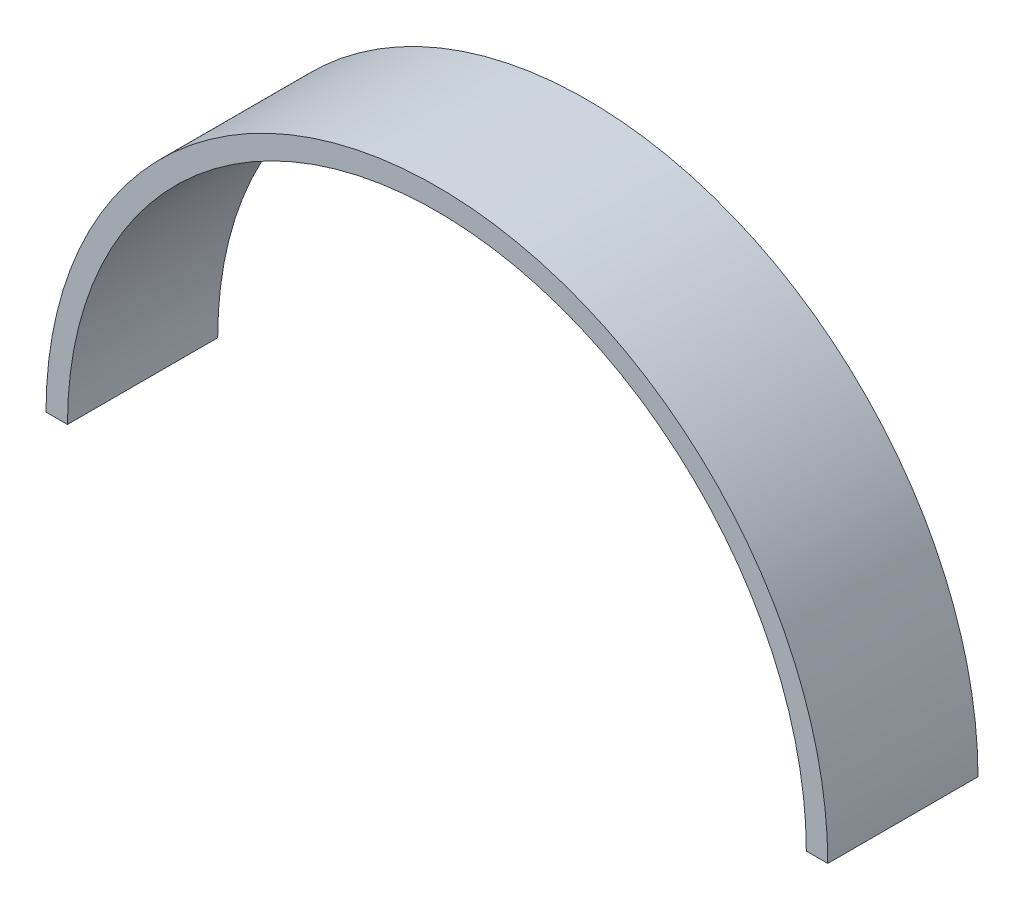
ISO-10303-21;
HEADER;
FILE_DESCRIPTION(('STEP AP214'),'2;1');
FILE_NAME('part.step','',(''),(''),'','','');
FILE_SCHEMA(('AUTOMOTIVE_DESIGN { 1 0 10303 214 1 1 1 1 }'));
ENDSEC;
DATA;
#1=APPLICATION_CONTEXT('core data for automotive mechanical design processes');
#2=APPLICATION_PROTOCOL_DEFINITION('international standard','automotive_design',2000,#1);
#3=PRODUCT_CONTEXT('',#1,'mechanical');
#4=PRODUCT('Part','Part','',(#3));
#5=PRODUCT_RELATED_PRODUCT_CATEGORY('part','',(#4));
#6=PRODUCT_DEFINITION_FORMATION('','',#4);
#7=PRODUCT_DEFINITION_CONTEXT('part definition',#1,'design');
#8=PRODUCT_DEFINITION('design','',#6,#7);
#9=PRODUCT_DEFINITION_SHAPE('','',#8);
#10=(LENGTH_UNIT() NAMED_UNIT(*) SI_UNIT(.MILLI.,.METRE.));
#11=(NAMED_UNIT(*) PLANE_ANGLE_UNIT() SI_UNIT($,.RADIAN.));
#12=(NAMED_UNIT(*) SI_UNIT($,.STERADIAN.) SOLID_ANGLE_UNIT());
#13=UNCERTAINTY_MEASURE_WITH_UNIT(LENGTH_MEASURE(1.E-05),#10,'distance_accuracy_value','');
#14=(GEOMETRIC_REPRESENTATION_CONTEXT(3) GLOBAL_UNCERTAINTY_ASSIGNED_CONTEXT((#13)) GLOBAL_UNIT_ASSIGNED_CONTEXT((#10,
#11,#12)) REPRESENTATION_CONTEXT('',''));
#15=CARTESIAN_POINT('',(0.,0.,0.));
#16=DIRECTION('',(0.,0.,1.));
#17=DIRECTION('',(1.,0.,0.));
#18=AXIS2_PLACEMENT_3D('',#15,#16,#17);
#19=CARTESIAN_POINT('',(-49.6,0.,-14.602822123976));
#20=DIRECTION('',(0.,0.,-1.));
#21=DIRECTION('',(-1.,0.,0.));
#22=AXIS2_PLACEMENT_3D('',#19,#20,#21);
#23=CYLINDRICAL_SURFACE('',#22,51.);
#24=CARTESIAN_POINT('',(-49.6,0.,-9.8));
#25=DIRECTION('',(0.,0.,-1.));
#26=DIRECTION('',(-1.,0.,0.));
#27=AXIS2_PLACEMENT_3D('',#24,#25,#26);
#28=CIRCLE('',#27,51.);
#29=CARTESIAN_POINT('',(-100.6,-3.56131096561999E-13,-9.8));
#30=VERTEX_POINT('',#29);
#31=CARTESIAN_POINT('',(1.4,0.,-9.8));
#32=VERTEX_POINT('',#31);
#33=EDGE_CURVE('E11',#30,#32,#28,.T.);
#34=ORIENTED_EDGE('',*,*,#33,.F.);
#35=DIRECTION('',(0.,0.,-1.));
#36=VECTOR('',#35,1.);
#37=CARTESIAN_POINT('',(-100.6,-3.56131096561999E-13,-9.8));
#38=LINE('',#37,#36);
#39=CARTESIAN_POINT('',(-100.6,-3.56131096561999E-13,9.8));
#40=VERTEX_POINT('',#39);
#41=EDGE_CURVE('E79',#40,#30,#38,.T.);
#42=ORIENTED_EDGE('',*,*,#41,.F.);
#43=CARTESIAN_POINT('',(-49.6,0.,9.8));
#44=DIRECTION('',(0.,0.,-1.));
#45=DIRECTION('',(-1.,0.,0.));
#46=AXIS2_PLACEMENT_3D('',#43,#44,#45);
#47=CIRCLE('',#46,51.);
#48=CARTESIAN_POINT('',(1.4,0.,9.8));
#49=VERTEX_POINT('',#48);
#50=EDGE_CURVE('E32',#40,#49,#47,.T.);
#51=ORIENTED_EDGE('',*,*,#50,.T.);
#52=DIRECTION('',(0.,0.,-1.));
#53=VECTOR('',#52,1.);
#54=CARTESIAN_POINT('',(1.4,0.,-9.8));
#55=LINE('',#54,#53);
#56=EDGE_CURVE('E68',#49,#32,#55,.T.);
#57=ORIENTED_EDGE('',*,*,#56,.T.);
#58=EDGE_LOOP('',(#34,#42,#51,#57));
#59=FACE_BOUND('',#58,.T.);
#60=ADVANCED_FACE('F17',(#59),#23,.T.);
#61=CARTESIAN_POINT('',(-97.8,-3.36578801064478E-13,-9.8));
#62=DIRECTION('',(0.,0.,1.));
#63=DIRECTION('',(1.,0.,0.));
#64=AXIS2_PLACEMENT_3D('',#61,#62,#63);
#65=PLANE('',#64);
#66=CARTESIAN_POINT('',(-49.6,0.,-9.8));
#67=DIRECTION('',(0.,0.,-1.));
#68=DIRECTION('',(-1.,0.,0.));
#69=AXIS2_PLACEMENT_3D('',#66,#67,#68);
#70=CIRCLE('',#69,48.2);
#71=CARTESIAN_POINT('',(-97.8,-3.36578801064478E-13,-9.8));
#72=VERTEX_POINT('',#71);
#73=CARTESIAN_POINT('',(-1.4,0.,-9.8));
#74=VERTEX_POINT('',#73);
#75=EDGE_CURVE('E25',#72,#74,#70,.T.);
#76=ORIENTED_EDGE('',*,*,#75,.F.);
#77=DIRECTION('',(1.,0.,0.));
#78=VECTOR('',#77,1.);
#79=CARTESIAN_POINT('',(-97.8,-3.36578801064478E-13,-9.8));
#80=LINE('',#79,#78);
#81=EDGE_CURVE('E64',#30,#72,#80,.T.);
#82=ORIENTED_EDGE('',*,*,#81,.F.);
#83=ORIENTED_EDGE('',*,*,#33,.T.);
#84=DIRECTION('',(-1.,0.,0.));
#85=VECTOR('',#84,1.);
#86=CARTESIAN_POINT('',(-1.4,0.,-9.8));
#87=LINE('',#86,#85);
#88=EDGE_CURVE('E61',#32,#74,#87,.T.);
#89=ORIENTED_EDGE('',*,*,#88,.T.);
#90=EDGE_LOOP('',(#76,#82,#83,#89));
#91=FACE_BOUND('',#90,.T.);
#92=ADVANCED_FACE('F19',(#91),#65,.F.);
#93=CARTESIAN_POINT('',(-49.6,0.,-14.602822123976));
#94=DIRECTION('',(0.,0.,-1.));
#95=DIRECTION('',(-1.,0.,0.));
#96=AXIS2_PLACEMENT_3D('',#93,#94,#95);
#97=CYLINDRICAL_SURFACE('',#96,48.2);
#98=CARTESIAN_POINT('',(-49.6,0.,9.8));
#99=DIRECTION('',(0.,0.,-1.));
#100=DIRECTION('',(-1.,0.,0.));
#101=AXIS2_PLACEMENT_3D('',#98,#99,#100);
#102=CIRCLE('',#101,48.2);
#103=CARTESIAN_POINT('',(-97.8,-3.36578801064478E-13,9.8));
#104=VERTEX_POINT('',#103);
#105=CARTESIAN_POINT('',(-1.4,0.,9.8));
#106=VERTEX_POINT('',#105);
#107=EDGE_CURVE('E40',#104,#106,#102,.T.);
#108=ORIENTED_EDGE('',*,*,#107,.F.);
#109=DIRECTION('',(0.,0.,1.));
#110=VECTOR('',#109,1.);
#111=CARTESIAN_POINT('',(-97.8,-3.36578801064478E-13,-9.8));
#112=LINE('',#111,#110);
#113=EDGE_CURVE('E82',#72,#104,#112,.T.);
#114=ORIENTED_EDGE('',*,*,#113,.F.);
#115=ORIENTED_EDGE('',*,*,#75,.T.);
#116=DIRECTION('',(0.,0.,1.));
#117=VECTOR('',#116,1.);
#118=CARTESIAN_POINT('',(-1.4,0.,-9.8));
#119=LINE('',#118,#117);
#120=EDGE_CURVE('E73',#74,#106,#119,.T.);
#121=ORIENTED_EDGE('',*,*,#120,.T.);
#122=EDGE_LOOP('',(#108,#114,#115,#121));
#123=FACE_BOUND('',#122,.T.);
#124=ADVANCED_FACE('F88',(#123),#97,.F.);
#125=CARTESIAN_POINT('',(-97.8,-3.36578801064478E-13,9.8));
#126=DIRECTION('',(0.,0.,-1.));
#127=DIRECTION('',(-1.,0.,0.));
#128=AXIS2_PLACEMENT_3D('',#125,#126,#127);
#129=PLANE('',#128);
#130=DIRECTION('',(-1.,0.,0.));
#131=VECTOR('',#130,1.);
#132=CARTESIAN_POINT('',(-97.8,-3.36578801064478E-13,9.8));
#133=LINE('',#132,#131);
#134=EDGE_CURVE('E84',#104,#40,#133,.T.);
#135=ORIENTED_EDGE('',*,*,#134,.F.);
#136=ORIENTED_EDGE('',*,*,#107,.T.);
#137=DIRECTION('',(1.,0.,0.));
#138=VECTOR('',#137,1.);
#139=CARTESIAN_POINT('',(-1.4,0.,9.8));
#140=LINE('',#139,#138);
#141=EDGE_CURVE('E75',#106,#49,#140,.T.);
#142=ORIENTED_EDGE('',*,*,#141,.T.);
#143=ORIENTED_EDGE('',*,*,#50,.F.);
#144=EDGE_LOOP('',(#135,#136,#142,#143));
#145=FACE_BOUND('',#144,.T.);
#146=ADVANCED_FACE('F91',(#145),#129,.F.);
#147=CARTESIAN_POINT('',(-99.2,-3.46354948813239E-13,0.));
#148=DIRECTION('',(0.,-1.,0.));
#149=DIRECTION('',(0.,0.,1.));
#150=AXIS2_PLACEMENT_3D('',#147,#148,#149);
#151=PLANE('',#150);
#152=ORIENTED_EDGE('',*,*,#41,.T.);
#153=ORIENTED_EDGE('',*,*,#81,.T.);
#154=ORIENTED_EDGE('',*,*,#113,.T.);
#155=ORIENTED_EDGE('',*,*,#134,.T.);
#156=EDGE_LOOP('',(#152,#153,#154,#155));
#157=FACE_BOUND('',#156,.T.);
#158=ADVANCED_FACE('F90',(#157),#151,.T.);
#159=CARTESIAN_POINT('',(0.,0.,0.));
#160=DIRECTION('',(0.,1.,0.));
#161=DIRECTION('',(0.,0.,1.));
#162=AXIS2_PLACEMENT_3D('',#159,#160,#161);
#163=PLANE('',#162);
#164=ORIENTED_EDGE('',*,*,#56,.F.);
#165=ORIENTED_EDGE('',*,*,#141,.F.);
#166=ORIENTED_EDGE('',*,*,#120,.F.);
#167=ORIENTED_EDGE('',*,*,#88,.F.);
#168=EDGE_LOOP('',(#164,#165,#166,#167));
#169=FACE_BOUND('',#168,.T.);
#170=ADVANCED_FACE('F72',(#169),#163,.F.);
#171=CLOSED_SHELL('',(#60,#92,#124,#146,#158,#170));
#172=MANIFOLD_SOLID_BREP('B1',#171);
#173=ADVANCED_BREP_SHAPE_REPRESENTATION('',(#18,#172),#14);
#174=SHAPE_DEFINITION_REPRESENTATION(#9,#173);
ENDSEC;
END-ISO-10303-21;
